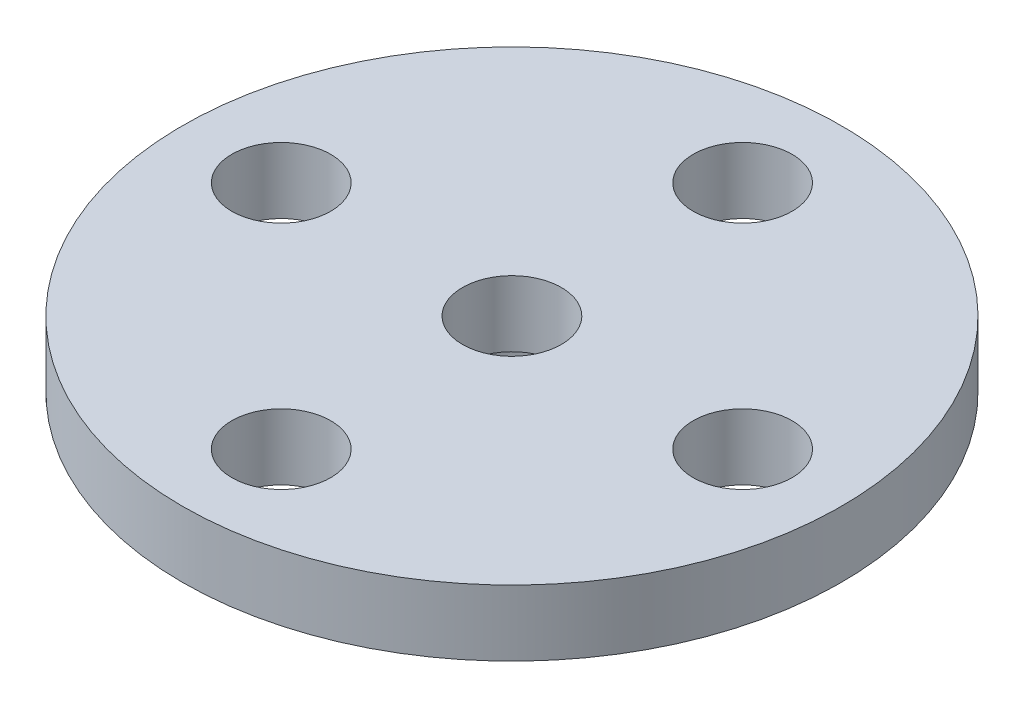
ISO-10303-21;
HEADER;
FILE_DESCRIPTION(('STEP AP214'),'2;1');
FILE_NAME('part.step','',(''),(''),'','','');
FILE_SCHEMA(('AUTOMOTIVE_DESIGN { 1 0 10303 214 1 1 1 1 }'));
ENDSEC;
DATA;
#1=APPLICATION_CONTEXT('core data for automotive mechanical design processes');
#2=APPLICATION_PROTOCOL_DEFINITION('international standard','automotive_design',2000,#1);
#3=PRODUCT_CONTEXT('',#1,'mechanical');
#4=PRODUCT('Part','Part','',(#3));
#5=PRODUCT_RELATED_PRODUCT_CATEGORY('part','',(#4));
#6=PRODUCT_DEFINITION_FORMATION('','',#4);
#7=PRODUCT_DEFINITION_CONTEXT('part definition',#1,'design');
#8=PRODUCT_DEFINITION('design','',#6,#7);
#9=PRODUCT_DEFINITION_SHAPE('','',#8);
#10=(LENGTH_UNIT() NAMED_UNIT(*) SI_UNIT(.MILLI.,.METRE.));
#11=(NAMED_UNIT(*) PLANE_ANGLE_UNIT() SI_UNIT($,.RADIAN.));
#12=(NAMED_UNIT(*) SI_UNIT($,.STERADIAN.) SOLID_ANGLE_UNIT());
#13=UNCERTAINTY_MEASURE_WITH_UNIT(LENGTH_MEASURE(1.E-05),#10,'distance_accuracy_value','');
#14=(GEOMETRIC_REPRESENTATION_CONTEXT(3) GLOBAL_UNCERTAINTY_ASSIGNED_CONTEXT((#13)) GLOBAL_UNIT_ASSIGNED_CONTEXT((#10,
#11,#12)) REPRESENTATION_CONTEXT('',''));
#15=CARTESIAN_POINT('',(0.,0.,0.));
#16=DIRECTION('',(0.,0.,1.));
#17=DIRECTION('',(1.,0.,0.));
#18=AXIS2_PLACEMENT_3D('',#15,#16,#17);
#19=CARTESIAN_POINT('',(0.,0.,0.));
#20=DIRECTION('',(0.,1.,0.));
#21=DIRECTION('',(0.,0.,1.));
#22=AXIS2_PLACEMENT_3D('',#19,#20,#21);
#23=PLANE('',#22);
#24=CARTESIAN_POINT('',(0.,0.,0.));
#25=DIRECTION('',(0.,1.,0.));
#26=DIRECTION('',(0.,0.,1.));
#27=AXIS2_PLACEMENT_3D('',#24,#25,#26);
#28=CIRCLE('',#27,1.5);
#29=CARTESIAN_POINT('',(0.,0.,1.5));
#30=VERTEX_POINT('',#29);
#31=EDGE_CURVE('E56',#30,#30,#28,.T.);
#32=ORIENTED_EDGE('',*,*,#31,.T.);
#33=EDGE_LOOP('',(#32));
#34=FACE_BOUND('',#33,.T.);
#35=CARTESIAN_POINT('',(0.,0.,0.));
#36=DIRECTION('',(0.,1.,0.));
#37=DIRECTION('',(0.,0.,1.));
#38=AXIS2_PLACEMENT_3D('',#35,#36,#37);
#39=CIRCLE('',#38,2.75);
#40=CARTESIAN_POINT('',(0.,0.,2.75));
#41=VERTEX_POINT('',#40);
#42=EDGE_CURVE('E10',#41,#41,#39,.T.);
#43=ORIENTED_EDGE('',*,*,#42,.F.);
#44=EDGE_LOOP('',(#43));
#45=FACE_BOUND('',#44,.T.);
#46=ADVANCED_FACE('F32',(#34,#45),#23,.F.);
#47=CARTESIAN_POINT('',(0.,2.,0.));
#48=DIRECTION('',(0.,1.,0.));
#49=DIRECTION('',(0.,0.,1.));
#50=AXIS2_PLACEMENT_3D('',#47,#48,#49);
#51=PLANE('',#50);
#52=CARTESIAN_POINT('',(7.,2.,0.));
#53=DIRECTION('',(0.,1.,0.));
#54=DIRECTION('',(0.,0.,1.));
#55=AXIS2_PLACEMENT_3D('',#52,#53,#54);
#56=CIRCLE('',#55,1.5);
#57=CARTESIAN_POINT('',(7.,2.,1.50000000000005));
#58=VERTEX_POINT('',#57);
#59=EDGE_CURVE('E65',#58,#58,#56,.T.);
#60=ORIENTED_EDGE('',*,*,#59,.F.);
#61=EDGE_LOOP('',(#60));
#62=FACE_BOUND('',#61,.T.);
#63=CARTESIAN_POINT('',(0.,2.,0.));
#64=DIRECTION('',(0.,1.,0.));
#65=DIRECTION('',(0.,0.,1.));
#66=AXIS2_PLACEMENT_3D('',#63,#64,#65);
#67=CIRCLE('',#66,1.5);
#68=CARTESIAN_POINT('',(0.,2.,1.5));
#69=VERTEX_POINT('',#68);
#70=EDGE_CURVE('E53',#69,#69,#67,.T.);
#71=ORIENTED_EDGE('',*,*,#70,.F.);
#72=EDGE_LOOP('',(#71));
#73=FACE_BOUND('',#72,.T.);
#74=CARTESIAN_POINT('',(0.,2.,0.));
#75=DIRECTION('',(0.,1.,0.));
#76=DIRECTION('',(0.,0.,1.));
#77=AXIS2_PLACEMENT_3D('',#74,#75,#76);
#78=CIRCLE('',#77,10.);
#79=CARTESIAN_POINT('',(0.,2.,10.));
#80=VERTEX_POINT('',#79);
#81=EDGE_CURVE('E39',#80,#80,#78,.T.);
#82=ORIENTED_EDGE('',*,*,#81,.T.);
#83=EDGE_LOOP('',(#82));
#84=FACE_BOUND('',#83,.T.);
#85=CARTESIAN_POINT('',(-7.,2.,0.));
#86=DIRECTION('',(0.,1.,0.));
#87=DIRECTION('',(0.,0.,1.));
#88=AXIS2_PLACEMENT_3D('',#85,#86,#87);
#89=CIRCLE('',#88,1.5);
#90=CARTESIAN_POINT('',(-7.,2.,1.5));
#91=VERTEX_POINT('',#90);
#92=EDGE_CURVE('E48',#91,#91,#89,.T.);
#93=ORIENTED_EDGE('',*,*,#92,.F.);
#94=EDGE_LOOP('',(#93));
#95=FACE_BOUND('',#94,.T.);
#96=CARTESIAN_POINT('',(0.,2.,-7.));
#97=DIRECTION('',(0.,1.,0.));
#98=DIRECTION('',(0.,0.,1.));
#99=AXIS2_PLACEMENT_3D('',#96,#97,#98);
#100=CIRCLE('',#99,1.5);
#101=CARTESIAN_POINT('',(0.,2.,-5.5));
#102=VERTEX_POINT('',#101);
#103=EDGE_CURVE('E59',#102,#102,#100,.T.);
#104=ORIENTED_EDGE('',*,*,#103,.F.);
#105=EDGE_LOOP('',(#104));
#106=FACE_BOUND('',#105,.T.);
#107=CARTESIAN_POINT('',(0.,2.,7.));
#108=DIRECTION('',(0.,1.,0.));
#109=DIRECTION('',(0.,0.,1.));
#110=AXIS2_PLACEMENT_3D('',#107,#108,#109);
#111=CIRCLE('',#110,1.5);
#112=CARTESIAN_POINT('',(0.,2.,8.5));
#113=VERTEX_POINT('',#112);
#114=EDGE_CURVE('E71',#113,#113,#111,.T.);
#115=ORIENTED_EDGE('',*,*,#114,.F.);
#116=EDGE_LOOP('',(#115));
#117=FACE_BOUND('',#116,.T.);
#118=ADVANCED_FACE('F101',(#62,#73,#84,#95,#106,#117),#51,.T.);
#119=CARTESIAN_POINT('',(0.,0.,0.));
#120=DIRECTION('',(0.,1.,0.));
#121=DIRECTION('',(0.,0.,1.));
#122=AXIS2_PLACEMENT_3D('',#119,#120,#121);
#123=CIRCLE('',#122,4.5);
#124=CARTESIAN_POINT('',(0.,0.,4.5));
#125=VERTEX_POINT('',#124);
#126=EDGE_CURVE('E80',#125,#125,#123,.T.);
#127=ORIENTED_EDGE('',*,*,#126,.T.);
#128=EDGE_LOOP('',(#127));
#129=FACE_BOUND('',#128,.T.);
#130=CARTESIAN_POINT('',(0.,0.,0.));
#131=DIRECTION('',(0.,1.,0.));
#132=DIRECTION('',(0.,0.,1.));
#133=AXIS2_PLACEMENT_3D('',#130,#131,#132);
#134=CIRCLE('',#133,10.);
#135=CARTESIAN_POINT('',(0.,0.,10.));
#136=VERTEX_POINT('',#135);
#137=EDGE_CURVE('E43',#136,#136,#134,.T.);
#138=ORIENTED_EDGE('',*,*,#137,.F.);
#139=EDGE_LOOP('',(#138));
#140=FACE_BOUND('',#139,.T.);
#141=CARTESIAN_POINT('',(-7.,0.,0.));
#142=DIRECTION('',(0.,1.,0.));
#143=DIRECTION('',(0.,0.,1.));
#144=AXIS2_PLACEMENT_3D('',#141,#142,#143);
#145=CIRCLE('',#144,1.5);
#146=CARTESIAN_POINT('',(-7.,0.,1.5));
#147=VERTEX_POINT('',#146);
#148=EDGE_CURVE('E50',#147,#147,#145,.T.);
#149=ORIENTED_EDGE('',*,*,#148,.T.);
#150=EDGE_LOOP('',(#149));
#151=FACE_BOUND('',#150,.T.);
#152=CARTESIAN_POINT('',(0.,0.,-7.));
#153=DIRECTION('',(0.,1.,0.));
#154=DIRECTION('',(0.,0.,1.));
#155=AXIS2_PLACEMENT_3D('',#152,#153,#154);
#156=CIRCLE('',#155,1.5);
#157=CARTESIAN_POINT('',(0.,0.,-5.5));
#158=VERTEX_POINT('',#157);
#159=EDGE_CURVE('E62',#158,#158,#156,.T.);
#160=ORIENTED_EDGE('',*,*,#159,.T.);
#161=EDGE_LOOP('',(#160));
#162=FACE_BOUND('',#161,.T.);
#163=CARTESIAN_POINT('',(7.,0.,0.));
#164=DIRECTION('',(0.,1.,0.));
#165=DIRECTION('',(0.,0.,1.));
#166=AXIS2_PLACEMENT_3D('',#163,#164,#165);
#167=CIRCLE('',#166,1.5);
#168=CARTESIAN_POINT('',(7.,0.,1.50000000000005));
#169=VERTEX_POINT('',#168);
#170=EDGE_CURVE('E68',#169,#169,#167,.T.);
#171=ORIENTED_EDGE('',*,*,#170,.T.);
#172=EDGE_LOOP('',(#171));
#173=FACE_BOUND('',#172,.T.);
#174=CARTESIAN_POINT('',(0.,0.,7.));
#175=DIRECTION('',(0.,1.,0.));
#176=DIRECTION('',(0.,0.,1.));
#177=AXIS2_PLACEMENT_3D('',#174,#175,#176);
#178=CIRCLE('',#177,1.5);
#179=CARTESIAN_POINT('',(0.,0.,8.5));
#180=VERTEX_POINT('',#179);
#181=EDGE_CURVE('E74',#180,#180,#178,.T.);
#182=ORIENTED_EDGE('',*,*,#181,.T.);
#183=EDGE_LOOP('',(#182));
#184=FACE_BOUND('',#183,.T.);
#185=ADVANCED_FACE('F103',(#129,#140,#151,#162,#173,#184),#23,.F.);
#186=CARTESIAN_POINT('',(0.,2.,0.));
#187=DIRECTION('',(0.,-1.,0.));
#188=DIRECTION('',(0.,0.,-1.));
#189=AXIS2_PLACEMENT_3D('',#186,#187,#188);
#190=CYLINDRICAL_SURFACE('',#189,10.);
#191=ORIENTED_EDGE('',*,*,#81,.F.);
#192=EDGE_LOOP('',(#191));
#193=FACE_BOUND('',#192,.T.);
#194=ORIENTED_EDGE('',*,*,#137,.T.);
#195=EDGE_LOOP('',(#194));
#196=FACE_BOUND('',#195,.T.);
#197=ADVANCED_FACE('F34',(#193,#196),#190,.T.);
#198=CARTESIAN_POINT('',(-7.,2.,0.));
#199=DIRECTION('',(0.,-1.,0.));
#200=DIRECTION('',(0.,0.,-1.));
#201=AXIS2_PLACEMENT_3D('',#198,#199,#200);
#202=CYLINDRICAL_SURFACE('',#201,1.5);
#203=ORIENTED_EDGE('',*,*,#92,.T.);
#204=EDGE_LOOP('',(#203));
#205=FACE_BOUND('',#204,.T.);
#206=ORIENTED_EDGE('',*,*,#148,.F.);
#207=EDGE_LOOP('',(#206));
#208=FACE_BOUND('',#207,.T.);
#209=ADVANCED_FACE('F115',(#205,#208),#202,.F.);
#210=CARTESIAN_POINT('',(0.,2.,0.));
#211=DIRECTION('',(0.,-1.,0.));
#212=DIRECTION('',(0.,0.,-1.));
#213=AXIS2_PLACEMENT_3D('',#210,#211,#212);
#214=CYLINDRICAL_SURFACE('',#213,1.5);
#215=ORIENTED_EDGE('',*,*,#70,.T.);
#216=EDGE_LOOP('',(#215));
#217=FACE_BOUND('',#216,.T.);
#218=ORIENTED_EDGE('',*,*,#31,.F.);
#219=EDGE_LOOP('',(#218));
#220=FACE_BOUND('',#219,.T.);
#221=ADVANCED_FACE('F146',(#217,#220),#214,.F.);
#222=CARTESIAN_POINT('',(0.,2.,-7.));
#223=DIRECTION('',(0.,-1.,0.));
#224=DIRECTION('',(0.,0.,-1.));
#225=AXIS2_PLACEMENT_3D('',#222,#223,#224);
#226=CYLINDRICAL_SURFACE('',#225,1.5);
#227=ORIENTED_EDGE('',*,*,#103,.T.);
#228=EDGE_LOOP('',(#227));
#229=FACE_BOUND('',#228,.T.);
#230=ORIENTED_EDGE('',*,*,#159,.F.);
#231=EDGE_LOOP('',(#230));
#232=FACE_BOUND('',#231,.T.);
#233=ADVANCED_FACE('F140',(#229,#232),#226,.F.);
#234=CARTESIAN_POINT('',(7.,2.,0.));
#235=DIRECTION('',(0.,-1.,0.));
#236=DIRECTION('',(0.,0.,-1.));
#237=AXIS2_PLACEMENT_3D('',#234,#235,#236);
#238=CYLINDRICAL_SURFACE('',#237,1.5);
#239=ORIENTED_EDGE('',*,*,#59,.T.);
#240=EDGE_LOOP('',(#239));
#241=FACE_BOUND('',#240,.T.);
#242=ORIENTED_EDGE('',*,*,#170,.F.);
#243=EDGE_LOOP('',(#242));
#244=FACE_BOUND('',#243,.T.);
#245=ADVANCED_FACE('F131',(#241,#244),#238,.F.);
#246=CARTESIAN_POINT('',(0.,2.,7.));
#247=DIRECTION('',(0.,-1.,0.));
#248=DIRECTION('',(0.,0.,-1.));
#249=AXIS2_PLACEMENT_3D('',#246,#247,#248);
#250=CYLINDRICAL_SURFACE('',#249,1.5);
#251=ORIENTED_EDGE('',*,*,#114,.T.);
#252=EDGE_LOOP('',(#251));
#253=FACE_BOUND('',#252,.T.);
#254=ORIENTED_EDGE('',*,*,#181,.F.);
#255=EDGE_LOOP('',(#254));
#256=FACE_BOUND('',#255,.T.);
#257=ADVANCED_FACE('F129',(#253,#256),#250,.F.);
#258=CARTESIAN_POINT('',(0.,-2.5,0.));
#259=DIRECTION('',(0.,1.,0.));
#260=DIRECTION('',(0.,0.,1.));
#261=AXIS2_PLACEMENT_3D('',#258,#259,#260);
#262=CYLINDRICAL_SURFACE('',#261,4.5);
#263=CARTESIAN_POINT('',(0.,-2.5,0.));
#264=DIRECTION('',(0.,1.,0.));
#265=DIRECTION('',(0.,0.,1.));
#266=AXIS2_PLACEMENT_3D('',#263,#264,#265);
#267=CIRCLE('',#266,4.5);
#268=CARTESIAN_POINT('',(0.,-2.5,4.5));
#269=VERTEX_POINT('',#268);
#270=EDGE_CURVE('E77',#269,#269,#267,.T.);
#271=ORIENTED_EDGE('',*,*,#270,.T.);
#272=EDGE_LOOP('',(#271));
#273=FACE_BOUND('',#272,.T.);
#274=ORIENTED_EDGE('',*,*,#126,.F.);
#275=EDGE_LOOP('',(#274));
#276=FACE_BOUND('',#275,.T.);
#277=ADVANCED_FACE('F98',(#273,#276),#262,.T.);
#278=CARTESIAN_POINT('',(0.,-2.5,0.));
#279=DIRECTION('',(0.,1.,0.));
#280=DIRECTION('',(0.,0.,1.));
#281=AXIS2_PLACEMENT_3D('',#278,#279,#280);
#282=PLANE('',#281);
#283=CARTESIAN_POINT('',(0.,-2.5,0.));
#284=DIRECTION('',(0.,1.,0.));
#285=DIRECTION('',(0.,0.,1.));
#286=AXIS2_PLACEMENT_3D('',#283,#284,#285);
#287=CIRCLE('',#286,2.75);
#288=CARTESIAN_POINT('',(0.,-2.5,2.75));
#289=VERTEX_POINT('',#288);
#290=EDGE_CURVE('E83',#289,#289,#287,.T.);
#291=ORIENTED_EDGE('',*,*,#290,.T.);
#292=EDGE_LOOP('',(#291));
#293=FACE_BOUND('',#292,.T.);
#294=ORIENTED_EDGE('',*,*,#270,.F.);
#295=EDGE_LOOP('',(#294));
#296=FACE_BOUND('',#295,.T.);
#297=ADVANCED_FACE('F89',(#293,#296),#282,.F.);
#298=CARTESIAN_POINT('',(0.,-2.5,0.));
#299=DIRECTION('',(0.,1.,0.));
#300=DIRECTION('',(0.,0.,1.));
#301=AXIS2_PLACEMENT_3D('',#298,#299,#300);
#302=CYLINDRICAL_SURFACE('',#301,2.75);
#303=ORIENTED_EDGE('',*,*,#290,.F.);
#304=EDGE_LOOP('',(#303));
#305=FACE_BOUND('',#304,.T.);
#306=ORIENTED_EDGE('',*,*,#42,.T.);
#307=EDGE_LOOP('',(#306));
#308=FACE_BOUND('',#307,.T.);
#309=ADVANCED_FACE('F92',(#305,#308),#302,.F.);
#310=CLOSED_SHELL('',(#46,#118,#185,#197,#209,#221,#233,#245,#257,#277,#297,#309));
#311=MANIFOLD_SOLID_BREP('B2',#310);
#312=ADVANCED_BREP_SHAPE_REPRESENTATION('',(#18,#311),#14);
#313=SHAPE_DEFINITION_REPRESENTATION(#9,#312);
ENDSEC;
END-ISO-10303-21;
